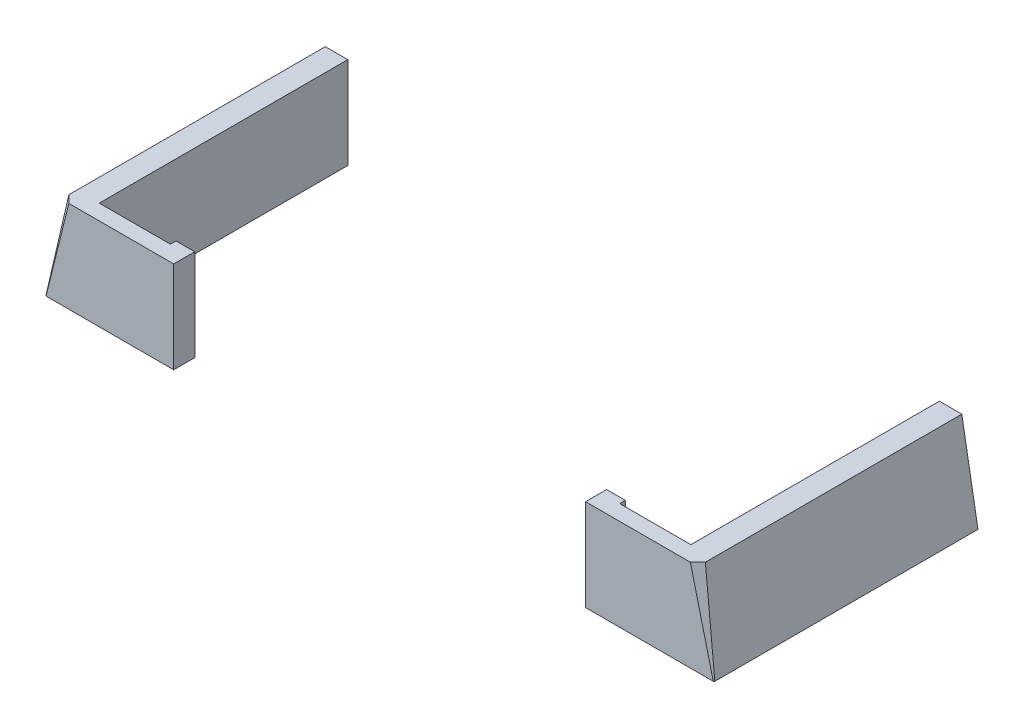
ISO-10303-21;
HEADER;
FILE_DESCRIPTION(('STEP AP214'),'2;1');
FILE_NAME('part.step','',(''),(''),'','','');
FILE_SCHEMA(('AUTOMOTIVE_DESIGN { 1 0 10303 214 1 1 1 1 }'));
ENDSEC;
DATA;
#1=APPLICATION_CONTEXT('core data for automotive mechanical design processes');
#2=APPLICATION_PROTOCOL_DEFINITION('international standard','automotive_design',2000,#1);
#3=PRODUCT_CONTEXT('',#1,'mechanical');
#4=PRODUCT('Part','Part','',(#3));
#5=PRODUCT_RELATED_PRODUCT_CATEGORY('part','',(#4));
#6=PRODUCT_DEFINITION_FORMATION('','',#4);
#7=PRODUCT_DEFINITION_CONTEXT('part definition',#1,'design');
#8=PRODUCT_DEFINITION('design','',#6,#7);
#9=PRODUCT_DEFINITION_SHAPE('','',#8);
#10=(LENGTH_UNIT() NAMED_UNIT(*) SI_UNIT(.MILLI.,.METRE.));
#11=(NAMED_UNIT(*) PLANE_ANGLE_UNIT() SI_UNIT($,.RADIAN.));
#12=(NAMED_UNIT(*) SI_UNIT($,.STERADIAN.) SOLID_ANGLE_UNIT());
#13=UNCERTAINTY_MEASURE_WITH_UNIT(LENGTH_MEASURE(1.E-05),#10,'distance_accuracy_value','');
#14=(GEOMETRIC_REPRESENTATION_CONTEXT(3) GLOBAL_UNCERTAINTY_ASSIGNED_CONTEXT((#13)) GLOBAL_UNIT_ASSIGNED_CONTEXT((#10,
#11,#12)) REPRESENTATION_CONTEXT('',''));
#15=CARTESIAN_POINT('',(0.,0.,0.));
#16=DIRECTION('',(0.,0.,1.));
#17=DIRECTION('',(1.,0.,0.));
#18=AXIS2_PLACEMENT_3D('',#15,#16,#17);
#19=CARTESIAN_POINT('',(170.,24.,37.24249361));
#20=DIRECTION('',(0.984807753012208,0.173648177666931,0.));
#21=DIRECTION('',(-0.173648177666931,0.984807753012208,0.));
#22=AXIS2_PLACEMENT_3D('',#19,#20,#21);
#23=PLANE('',#22);
#24=DIRECTION('',(0.,0.,-1.));
#25=VECTOR('',#24,1.);
#26=CARTESIAN_POINT('',(178.640022054715,-25.,37.24249361));
#27=LINE('',#26,#25);
#28=CARTESIAN_POINT('',(178.640022054715,-25.,40.8213079242656));
#29=VERTEX_POINT('',#28);
#30=CARTESIAN_POINT('',(178.640022054715,-25.,-99.75750639));
#31=VERTEX_POINT('',#30);
#32=EDGE_CURVE('E61',#29,#31,#27,.T.);
#33=ORIENTED_EDGE('',*,*,#32,.T.);
#34=DIRECTION('',(-0.173648177666931,0.984807753012208,0.));
#35=VECTOR('',#34,1.);
#36=CARTESIAN_POINT('',(204.584241247155,-172.136978630262,-99.75750639));
#37=LINE('',#36,#35);
#38=CARTESIAN_POINT('',(170.,24.,-99.75750639));
#39=VERTEX_POINT('',#38);
#40=EDGE_CURVE('E168',#31,#39,#37,.T.);
#41=ORIENTED_EDGE('',*,*,#40,.T.);
#42=DIRECTION('',(0.,0.,1.));
#43=VECTOR('',#42,1.);
#44=CARTESIAN_POINT('',(170.,24.,37.24249361));
#45=LINE('',#44,#43);
#46=CARTESIAN_POINT('',(170.,24.,37.24249361));
#47=VERTEX_POINT('',#46);
#48=EDGE_CURVE('E138',#39,#47,#45,.T.);
#49=ORIENTED_EDGE('',*,*,#48,.T.);
#50=DIRECTION('',(-0.173200723896954,0.982270116581418,-0.0717420888509561));
#51=VECTOR('',#50,1.);
#52=CARTESIAN_POINT('',(170.,24.,37.24249361));
#53=LINE('',#52,#51);
#54=EDGE_CURVE('E162',#29,#47,#53,.T.);
#55=ORIENTED_EDGE('',*,*,#54,.F.);
#56=EDGE_LOOP('',(#33,#41,#49,#55));
#57=FACE_BOUND('',#56,.T.);
#58=ADVANCED_FACE('F54',(#57),#23,.T.);
#59=CARTESIAN_POINT('',(170.,-178.235113469466,-99.75750639));
#60=DIRECTION('',(0.,0.,-1.));
#61=DIRECTION('',(1.,0.,0.));
#62=AXIS2_PLACEMENT_3D('',#59,#60,#61);
#63=PLANE('',#62);
#64=DIRECTION('',(-1.,0.,0.));
#65=VECTOR('',#64,1.);
#66=CARTESIAN_POINT('',(170.,-25.,-99.75750639));
#67=LINE('',#66,#65);
#68=CARTESIAN_POINT('',(158.,-25.,-99.7575063899999));
#69=VERTEX_POINT('',#68);
#70=EDGE_CURVE('E89',#31,#69,#67,.T.);
#71=ORIENTED_EDGE('',*,*,#70,.T.);
#72=DIRECTION('',(0.,1.,0.));
#73=VECTOR('',#72,1.);
#74=CARTESIAN_POINT('',(158.,-178.235113469466,-99.7575063899999));
#75=LINE('',#74,#73);
#76=CARTESIAN_POINT('',(158.,24.,-99.7575063899999));
#77=VERTEX_POINT('',#76);
#78=EDGE_CURVE('E161',#69,#77,#75,.T.);
#79=ORIENTED_EDGE('',*,*,#78,.T.);
#80=DIRECTION('',(1.,0.,0.));
#81=VECTOR('',#80,1.);
#82=CARTESIAN_POINT('',(170.,24.,-99.75750639));
#83=LINE('',#82,#81);
#84=EDGE_CURVE('E159',#77,#39,#83,.T.);
#85=ORIENTED_EDGE('',*,*,#84,.T.);
#86=ORIENTED_EDGE('',*,*,#40,.F.);
#87=EDGE_LOOP('',(#71,#79,#85,#86));
#88=FACE_BOUND('',#87,.T.);
#89=ADVANCED_FACE('F213',(#88),#63,.T.);
#90=CARTESIAN_POINT('',(158.,-178.235113469466,-99.7575063899999));
#91=DIRECTION('',(-1.,0.,0.));
#92=DIRECTION('',(0.,0.,-1.));
#93=AXIS2_PLACEMENT_3D('',#90,#91,#92);
#94=PLANE('',#93);
#95=DIRECTION('',(0.,0.,1.));
#96=VECTOR('',#95,1.);
#97=CARTESIAN_POINT('',(158.,-25.,-99.7575063899999));
#98=LINE('',#97,#96);
#99=CARTESIAN_POINT('',(158.,-25.,33.00249361));
#100=VERTEX_POINT('',#99);
#101=EDGE_CURVE('E95',#69,#100,#98,.T.);
#102=ORIENTED_EDGE('',*,*,#101,.T.);
#103=DIRECTION('',(0.,1.,0.));
#104=VECTOR('',#103,1.);
#105=CARTESIAN_POINT('',(158.,-178.235113469466,33.00249361));
#106=LINE('',#105,#104);
#107=CARTESIAN_POINT('',(158.,24.,33.00249361));
#108=VERTEX_POINT('',#107);
#109=EDGE_CURVE('E170',#100,#108,#106,.T.);
#110=ORIENTED_EDGE('',*,*,#109,.T.);
#111=DIRECTION('',(0.,0.,-1.));
#112=VECTOR('',#111,1.);
#113=CARTESIAN_POINT('',(158.,24.,-99.7575063899999));
#114=LINE('',#113,#112);
#115=EDGE_CURVE('E157',#108,#77,#114,.T.);
#116=ORIENTED_EDGE('',*,*,#115,.T.);
#117=ORIENTED_EDGE('',*,*,#78,.F.);
#118=EDGE_LOOP('',(#102,#110,#116,#117));
#119=FACE_BOUND('',#118,.T.);
#120=ADVANCED_FACE('F218',(#119),#94,.T.);
#121=CARTESIAN_POINT('',(120.,-178.235113469466,33.00249361));
#122=DIRECTION('',(0.,0.,-1.));
#123=DIRECTION('',(1.,0.,0.));
#124=AXIS2_PLACEMENT_3D('',#121,#122,#123);
#125=PLANE('',#124);
#126=DIRECTION('',(-1.,0.,0.));
#127=VECTOR('',#126,1.);
#128=CARTESIAN_POINT('',(120.,-25.,33.00249361));
#129=LINE('',#128,#127);
#130=CARTESIAN_POINT('',(120.,-25.,33.00249361));
#131=VERTEX_POINT('',#130);
#132=EDGE_CURVE('E134',#100,#131,#129,.T.);
#133=ORIENTED_EDGE('',*,*,#132,.T.);
#134=DIRECTION('',(0.,1.,0.));
#135=VECTOR('',#134,1.);
#136=CARTESIAN_POINT('',(120.,-178.235113469466,33.00249361));
#137=LINE('',#136,#135);
#138=CARTESIAN_POINT('',(120.,24.,33.00249361));
#139=VERTEX_POINT('',#138);
#140=EDGE_CURVE('E123',#131,#139,#137,.T.);
#141=ORIENTED_EDGE('',*,*,#140,.T.);
#142=DIRECTION('',(1.,0.,0.));
#143=VECTOR('',#142,1.);
#144=CARTESIAN_POINT('',(120.,24.,33.00249361));
#145=LINE('',#144,#143);
#146=EDGE_CURVE('E155',#139,#108,#145,.T.);
#147=ORIENTED_EDGE('',*,*,#146,.T.);
#148=ORIENTED_EDGE('',*,*,#109,.F.);
#149=EDGE_LOOP('',(#133,#141,#147,#148));
#150=FACE_BOUND('',#149,.T.);
#151=ADVANCED_FACE('F224',(#150),#125,.T.);
#152=CARTESIAN_POINT('',(120.,-178.235113469466,30.));
#153=DIRECTION('',(1.,0.,0.));
#154=DIRECTION('',(0.,0.,1.));
#155=AXIS2_PLACEMENT_3D('',#152,#153,#154);
#156=PLANE('',#155);
#157=DIRECTION('',(0.,0.,-1.));
#158=VECTOR('',#157,1.);
#159=CARTESIAN_POINT('',(120.,-25.,30.));
#160=LINE('',#159,#158);
#161=CARTESIAN_POINT('',(120.,-25.,30.));
#162=VERTEX_POINT('',#161);
#163=EDGE_CURVE('E110',#131,#162,#160,.T.);
#164=ORIENTED_EDGE('',*,*,#163,.T.);
#165=DIRECTION('',(0.,1.,0.));
#166=VECTOR('',#165,1.);
#167=CARTESIAN_POINT('',(120.,-178.235113469466,30.));
#168=LINE('',#167,#166);
#169=CARTESIAN_POINT('',(120.,24.,30.));
#170=VERTEX_POINT('',#169);
#171=EDGE_CURVE('E120',#162,#170,#168,.T.);
#172=ORIENTED_EDGE('',*,*,#171,.T.);
#173=DIRECTION('',(0.,0.,1.));
#174=VECTOR('',#173,1.);
#175=CARTESIAN_POINT('',(120.,24.,30.));
#176=LINE('',#175,#174);
#177=EDGE_CURVE('E154',#170,#139,#176,.T.);
#178=ORIENTED_EDGE('',*,*,#177,.T.);
#179=ORIENTED_EDGE('',*,*,#140,.F.);
#180=EDGE_LOOP('',(#164,#172,#178,#179));
#181=FACE_BOUND('',#180,.T.);
#182=ADVANCED_FACE('F129',(#181),#156,.T.);
#183=CARTESIAN_POINT('',(120.,-178.235113469466,30.));
#184=DIRECTION('',(0.,0.,-1.));
#185=DIRECTION('',(1.,0.,0.));
#186=AXIS2_PLACEMENT_3D('',#183,#184,#185);
#187=PLANE('',#186);
#188=DIRECTION('',(-1.,0.,0.));
#189=VECTOR('',#188,1.);
#190=CARTESIAN_POINT('',(120.,-25.,30.));
#191=LINE('',#190,#189);
#192=CARTESIAN_POINT('',(110.,-25.,30.));
#193=VERTEX_POINT('',#192);
#194=EDGE_CURVE('E101',#162,#193,#191,.T.);
#195=ORIENTED_EDGE('',*,*,#194,.T.);
#196=DIRECTION('',(0.,1.,0.));
#197=VECTOR('',#196,1.);
#198=CARTESIAN_POINT('',(110.,-178.235113469466,30.));
#199=LINE('',#198,#197);
#200=CARTESIAN_POINT('',(110.,24.,30.));
#201=VERTEX_POINT('',#200);
#202=EDGE_CURVE('E127',#193,#201,#199,.T.);
#203=ORIENTED_EDGE('',*,*,#202,.T.);
#204=DIRECTION('',(1.,0.,0.));
#205=VECTOR('',#204,1.);
#206=CARTESIAN_POINT('',(120.,24.,30.));
#207=LINE('',#206,#205);
#208=EDGE_CURVE('E122',#201,#170,#207,.T.);
#209=ORIENTED_EDGE('',*,*,#208,.T.);
#210=ORIENTED_EDGE('',*,*,#171,.F.);
#211=EDGE_LOOP('',(#195,#203,#209,#210));
#212=FACE_BOUND('',#211,.T.);
#213=ADVANCED_FACE('F117',(#212),#187,.T.);
#214=CARTESIAN_POINT('',(110.,-178.235113469466,30.));
#215=DIRECTION('',(-1.,0.,0.));
#216=DIRECTION('',(0.,0.,-1.));
#217=AXIS2_PLACEMENT_3D('',#214,#215,#216);
#218=PLANE('',#217);
#219=DIRECTION('',(0.,0.,1.));
#220=VECTOR('',#219,1.);
#221=CARTESIAN_POINT('',(110.,-25.,30.));
#222=LINE('',#221,#220);
#223=CARTESIAN_POINT('',(110.,-25.,41.24249361));
#224=VERTEX_POINT('',#223);
#225=EDGE_CURVE('E109',#193,#224,#222,.T.);
#226=ORIENTED_EDGE('',*,*,#225,.T.);
#227=DIRECTION('',(0.,1.,0.));
#228=VECTOR('',#227,1.);
#229=CARTESIAN_POINT('',(110.,-178.235113469466,41.24249361));
#230=LINE('',#229,#228);
#231=CARTESIAN_POINT('',(110.,24.,41.24249361));
#232=VERTEX_POINT('',#231);
#233=EDGE_CURVE('E175',#224,#232,#230,.T.);
#234=ORIENTED_EDGE('',*,*,#233,.T.);
#235=DIRECTION('',(0.,0.,-1.));
#236=VECTOR('',#235,1.);
#237=CARTESIAN_POINT('',(110.,24.,30.));
#238=LINE('',#237,#236);
#239=EDGE_CURVE('E150',#232,#201,#238,.T.);
#240=ORIENTED_EDGE('',*,*,#239,.T.);
#241=ORIENTED_EDGE('',*,*,#202,.F.);
#242=EDGE_LOOP('',(#226,#234,#240,#241));
#243=FACE_BOUND('',#242,.T.);
#244=ADVANCED_FACE('F183',(#243),#218,.T.);
#245=CARTESIAN_POINT('',(110.,-178.235113469466,41.24249361));
#246=DIRECTION('',(0.,0.,1.));
#247=DIRECTION('',(-1.,0.,0.));
#248=AXIS2_PLACEMENT_3D('',#245,#246,#247);
#249=PLANE('',#248);
#250=DIRECTION('',(1.,0.,0.));
#251=VECTOR('',#250,1.);
#252=CARTESIAN_POINT('',(110.,-25.,41.24249361));
#253=LINE('',#252,#251);
#254=CARTESIAN_POINT('',(178.21883636898,-25.,41.24249361));
#255=VERTEX_POINT('',#254);
#256=EDGE_CURVE('E73',#224,#255,#253,.T.);
#257=ORIENTED_EDGE('',*,*,#256,.T.);
#258=DIRECTION('',(-0.241954785752365,0.970287525247814,0.));
#259=VECTOR('',#258,1.);
#260=CARTESIAN_POINT('',(166.,24.,41.24249361));
#261=LINE('',#260,#259);
#262=CARTESIAN_POINT('',(166.,24.,41.24249361));
#263=VERTEX_POINT('',#262);
#264=EDGE_CURVE('E59',#255,#263,#261,.T.);
#265=ORIENTED_EDGE('',*,*,#264,.T.);
#266=DIRECTION('',(-1.,0.,0.));
#267=VECTOR('',#266,1.);
#268=CARTESIAN_POINT('',(110.,24.,41.24249361));
#269=LINE('',#268,#267);
#270=EDGE_CURVE('E144',#263,#232,#269,.T.);
#271=ORIENTED_EDGE('',*,*,#270,.T.);
#272=ORIENTED_EDGE('',*,*,#233,.F.);
#273=EDGE_LOOP('',(#257,#265,#271,#272));
#274=FACE_BOUND('',#273,.T.);
#275=ADVANCED_FACE('F209',(#274),#249,.T.);
#276=CARTESIAN_POINT('',(166.,24.,41.24249361));
#277=DIRECTION('',(0.696364240320019,0.173648177666931,0.696364240320019));
#278=DIRECTION('',(-0.122787803968973,0.984807753012208,-0.122787803968973));
#279=AXIS2_PLACEMENT_3D('',#276,#277,#278);
#280=PLANE('',#279);
#281=DIRECTION('',(0.707106781186548,0.,-0.707106781186548));
#282=VECTOR('',#281,1.);
#283=CARTESIAN_POINT('',(172.10941818449,-25.,47.3519117944902));
#284=LINE('',#283,#282);
#285=EDGE_CURVE('E12',#255,#29,#284,.T.);
#286=ORIENTED_EDGE('',*,*,#285,.T.);
#287=ORIENTED_EDGE('',*,*,#54,.T.);
#288=DIRECTION('',(-0.707106781186547,0.,0.707106781186547));
#289=VECTOR('',#288,1.);
#290=CARTESIAN_POINT('',(166.,24.,41.24249361));
#291=LINE('',#290,#289);
#292=EDGE_CURVE('E142',#47,#263,#291,.T.);
#293=ORIENTED_EDGE('',*,*,#292,.T.);
#294=ORIENTED_EDGE('',*,*,#264,.F.);
#295=EDGE_LOOP('',(#286,#287,#293,#294));
#296=FACE_BOUND('',#295,.T.);
#297=ADVANCED_FACE('F207',(#296),#280,.T.);
#298=CARTESIAN_POINT('',(0.,24.,0.));
#299=DIRECTION('',(0.,-1.,0.));
#300=DIRECTION('',(0.,0.,-1.));
#301=AXIS2_PLACEMENT_3D('',#298,#299,#300);
#302=PLANE('',#301);
#303=ORIENTED_EDGE('',*,*,#48,.F.);
#304=ORIENTED_EDGE('',*,*,#84,.F.);
#305=ORIENTED_EDGE('',*,*,#115,.F.);
#306=ORIENTED_EDGE('',*,*,#146,.F.);
#307=ORIENTED_EDGE('',*,*,#177,.F.);
#308=ORIENTED_EDGE('',*,*,#208,.F.);
#309=ORIENTED_EDGE('',*,*,#239,.F.);
#310=ORIENTED_EDGE('',*,*,#270,.F.);
#311=ORIENTED_EDGE('',*,*,#292,.F.);
#312=EDGE_LOOP('',(#303,#304,#305,#306,#307,#308,#309,#310,#311));
#313=FACE_BOUND('',#312,.T.);
#314=ADVANCED_FACE('F214',(#313),#302,.F.);
#315=CARTESIAN_POINT('',(0.,-25.,0.));
#316=DIRECTION('',(0.,1.,0.));
#317=DIRECTION('',(0.,0.,1.));
#318=AXIS2_PLACEMENT_3D('',#315,#316,#317);
#319=PLANE('',#318);
#320=ORIENTED_EDGE('',*,*,#32,.F.);
#321=ORIENTED_EDGE('',*,*,#285,.F.);
#322=ORIENTED_EDGE('',*,*,#256,.F.);
#323=ORIENTED_EDGE('',*,*,#225,.F.);
#324=ORIENTED_EDGE('',*,*,#194,.F.);
#325=ORIENTED_EDGE('',*,*,#163,.F.);
#326=ORIENTED_EDGE('',*,*,#132,.F.);
#327=ORIENTED_EDGE('',*,*,#101,.F.);
#328=ORIENTED_EDGE('',*,*,#70,.F.);
#329=EDGE_LOOP('',(#320,#321,#322,#323,#324,#325,#326,#327,#328));
#330=FACE_BOUND('',#329,.T.);
#331=ADVANCED_FACE('F102',(#330),#319,.F.);
#332=CLOSED_SHELL('',(#58,#89,#120,#151,#182,#213,#244,#275,#297,#314,#331));
#333=MANIFOLD_SOLID_BREP('B2',#332);
#334=CARTESIAN_POINT('',(-170.,24.,37.24249361));
#335=DIRECTION('',(-0.984807753012208,0.173648177666931,0.));
#336=DIRECTION('',(0.173648177666931,0.984807753012208,0.));
#337=AXIS2_PLACEMENT_3D('',#334,#335,#336);
#338=PLANE('',#337);
#339=DIRECTION('',(0.,0.,-1.));
#340=VECTOR('',#339,1.);
#341=CARTESIAN_POINT('',(-178.640022054715,-25.,37.24249361));
#342=LINE('',#341,#340);
#343=CARTESIAN_POINT('',(-178.640022054715,-25.,40.8213079242656));
#344=VERTEX_POINT('',#343);
#345=CARTESIAN_POINT('',(-178.640022054715,-25.,-99.75750639));
#346=VERTEX_POINT('',#345);
#347=EDGE_CURVE('E325',#344,#346,#342,.T.);
#348=ORIENTED_EDGE('',*,*,#347,.F.);
#349=DIRECTION('',(0.173200723896954,0.982270116581418,-0.0717420888509561));
#350=VECTOR('',#349,1.);
#351=CARTESIAN_POINT('',(-170.,24.,37.24249361));
#352=LINE('',#351,#350);
#353=CARTESIAN_POINT('',(-170.,24.,37.24249361));
#354=VERTEX_POINT('',#353);
#355=EDGE_CURVE('E396',#344,#354,#352,.T.);
#356=ORIENTED_EDGE('',*,*,#355,.T.);
#357=DIRECTION('',(0.,0.,1.));
#358=VECTOR('',#357,1.);
#359=CARTESIAN_POINT('',(-170.,24.,37.24249361));
#360=LINE('',#359,#358);
#361=CARTESIAN_POINT('',(-170.,24.,-99.75750639));
#362=VERTEX_POINT('',#361);
#363=EDGE_CURVE('E453',#362,#354,#360,.T.);
#364=ORIENTED_EDGE('',*,*,#363,.F.);
#365=DIRECTION('',(0.173648177666931,0.984807753012208,0.));
#366=VECTOR('',#365,1.);
#367=CARTESIAN_POINT('',(-204.584241247155,-172.136978630262,-99.75750639));
#368=LINE('',#367,#366);
#369=EDGE_CURVE('E407',#346,#362,#368,.T.);
#370=ORIENTED_EDGE('',*,*,#369,.F.);
#371=EDGE_LOOP('',(#348,#356,#364,#370));
#372=FACE_BOUND('',#371,.T.);
#373=ADVANCED_FACE('F315',(#372),#338,.T.);
#374=CARTESIAN_POINT('',(-170.,-178.235113469466,-99.75750639));
#375=DIRECTION('',(0.,0.,-1.));
#376=DIRECTION('',(-1.,0.,0.));
#377=AXIS2_PLACEMENT_3D('',#374,#375,#376);
#378=PLANE('',#377);
#379=DIRECTION('',(1.,0.,0.));
#380=VECTOR('',#379,1.);
#381=CARTESIAN_POINT('',(-170.,-25.,-99.75750639));
#382=LINE('',#381,#380);
#383=CARTESIAN_POINT('',(-158.,-25.,-99.7575063899999));
#384=VERTEX_POINT('',#383);
#385=EDGE_CURVE('E346',#346,#384,#382,.T.);
#386=ORIENTED_EDGE('',*,*,#385,.F.);
#387=ORIENTED_EDGE('',*,*,#369,.T.);
#388=DIRECTION('',(-1.,0.,0.));
#389=VECTOR('',#388,1.);
#390=CARTESIAN_POINT('',(-170.,24.,-99.75750639));
#391=LINE('',#390,#389);
#392=CARTESIAN_POINT('',(-158.,24.,-99.7575063899999));
#393=VERTEX_POINT('',#392);
#394=EDGE_CURVE('E401',#393,#362,#391,.T.);
#395=ORIENTED_EDGE('',*,*,#394,.F.);
#396=DIRECTION('',(0.,1.,0.));
#397=VECTOR('',#396,1.);
#398=CARTESIAN_POINT('',(-158.,-178.235113469466,-99.7575063899999));
#399=LINE('',#398,#397);
#400=EDGE_CURVE('E408',#384,#393,#399,.T.);
#401=ORIENTED_EDGE('',*,*,#400,.F.);
#402=EDGE_LOOP('',(#386,#387,#395,#401));
#403=FACE_BOUND('',#402,.T.);
#404=ADVANCED_FACE('F503',(#403),#378,.T.);
#405=CARTESIAN_POINT('',(-158.,-178.235113469466,-99.7575063899999));
#406=DIRECTION('',(1.,0.,0.));
#407=DIRECTION('',(0.,0.,-1.));
#408=AXIS2_PLACEMENT_3D('',#405,#406,#407);
#409=PLANE('',#408);
#410=DIRECTION('',(0.,0.,1.));
#411=VECTOR('',#410,1.);
#412=CARTESIAN_POINT('',(-158.,-25.,-99.7575063899999));
#413=LINE('',#412,#411);
#414=CARTESIAN_POINT('',(-158.,-25.,33.00249361));
#415=VERTEX_POINT('',#414);
#416=EDGE_CURVE('E462',#384,#415,#413,.T.);
#417=ORIENTED_EDGE('',*,*,#416,.F.);
#418=ORIENTED_EDGE('',*,*,#400,.T.);
#419=DIRECTION('',(0.,0.,-1.));
#420=VECTOR('',#419,1.);
#421=CARTESIAN_POINT('',(-158.,24.,-99.7575063899999));
#422=LINE('',#421,#420);
#423=CARTESIAN_POINT('',(-158.,24.,33.00249361));
#424=VERTEX_POINT('',#423);
#425=EDGE_CURVE('E431',#424,#393,#422,.T.);
#426=ORIENTED_EDGE('',*,*,#425,.F.);
#427=DIRECTION('',(0.,1.,0.));
#428=VECTOR('',#427,1.);
#429=CARTESIAN_POINT('',(-158.,-178.235113469466,33.00249361));
#430=LINE('',#429,#428);
#431=EDGE_CURVE('E394',#415,#424,#430,.T.);
#432=ORIENTED_EDGE('',*,*,#431,.F.);
#433=EDGE_LOOP('',(#417,#418,#426,#432));
#434=FACE_BOUND('',#433,.T.);
#435=ADVANCED_FACE('F475',(#434),#409,.T.);
#436=CARTESIAN_POINT('',(-120.,-178.235113469466,33.00249361));
#437=DIRECTION('',(0.,0.,-1.));
#438=DIRECTION('',(-1.,0.,0.));
#439=AXIS2_PLACEMENT_3D('',#436,#437,#438);
#440=PLANE('',#439);
#441=DIRECTION('',(1.,0.,0.));
#442=VECTOR('',#441,1.);
#443=CARTESIAN_POINT('',(-120.,-25.,33.00249361));
#444=LINE('',#443,#442);
#445=CARTESIAN_POINT('',(-120.,-25.,33.00249361));
#446=VERTEX_POINT('',#445);
#447=EDGE_CURVE('E361',#415,#446,#444,.T.);
#448=ORIENTED_EDGE('',*,*,#447,.F.);
#449=ORIENTED_EDGE('',*,*,#431,.T.);
#450=DIRECTION('',(-1.,0.,0.));
#451=VECTOR('',#450,1.);
#452=CARTESIAN_POINT('',(-120.,24.,33.00249361));
#453=LINE('',#452,#451);
#454=CARTESIAN_POINT('',(-120.,24.,33.00249361));
#455=VERTEX_POINT('',#454);
#456=EDGE_CURVE('E432',#455,#424,#453,.T.);
#457=ORIENTED_EDGE('',*,*,#456,.F.);
#458=DIRECTION('',(0.,1.,0.));
#459=VECTOR('',#458,1.);
#460=CARTESIAN_POINT('',(-120.,-178.235113469466,33.00249361));
#461=LINE('',#460,#459);
#462=EDGE_CURVE('E390',#446,#455,#461,.T.);
#463=ORIENTED_EDGE('',*,*,#462,.F.);
#464=EDGE_LOOP('',(#448,#449,#457,#463));
#465=FACE_BOUND('',#464,.T.);
#466=ADVANCED_FACE('F469',(#465),#440,.T.);
#467=CARTESIAN_POINT('',(-120.,-178.235113469466,30.));
#468=DIRECTION('',(-1.,0.,0.));
#469=DIRECTION('',(0.,0.,1.));
#470=AXIS2_PLACEMENT_3D('',#467,#468,#469);
#471=PLANE('',#470);
#472=DIRECTION('',(0.,0.,-1.));
#473=VECTOR('',#472,1.);
#474=CARTESIAN_POINT('',(-120.,-25.,30.));
#475=LINE('',#474,#473);
#476=CARTESIAN_POINT('',(-120.,-25.,30.));
#477=VERTEX_POINT('',#476);
#478=EDGE_CURVE('E356',#446,#477,#475,.T.);
#479=ORIENTED_EDGE('',*,*,#478,.F.);
#480=ORIENTED_EDGE('',*,*,#462,.T.);
#481=DIRECTION('',(0.,0.,1.));
#482=VECTOR('',#481,1.);
#483=CARTESIAN_POINT('',(-120.,24.,30.));
#484=LINE('',#483,#482);
#485=CARTESIAN_POINT('',(-120.,24.,30.));
#486=VERTEX_POINT('',#485);
#487=EDGE_CURVE('E381',#486,#455,#484,.T.);
#488=ORIENTED_EDGE('',*,*,#487,.F.);
#489=DIRECTION('',(0.,1.,0.));
#490=VECTOR('',#489,1.);
#491=CARTESIAN_POINT('',(-120.,-178.235113469466,30.));
#492=LINE('',#491,#490);
#493=EDGE_CURVE('E376',#477,#486,#492,.T.);
#494=ORIENTED_EDGE('',*,*,#493,.F.);
#495=EDGE_LOOP('',(#479,#480,#488,#494));
#496=FACE_BOUND('',#495,.T.);
#497=ADVANCED_FACE('F385',(#496),#471,.T.);
#498=CARTESIAN_POINT('',(-120.,-178.235113469466,30.));
#499=DIRECTION('',(0.,0.,-1.));
#500=DIRECTION('',(-1.,0.,0.));
#501=AXIS2_PLACEMENT_3D('',#498,#499,#500);
#502=PLANE('',#501);
#503=DIRECTION('',(1.,0.,0.));
#504=VECTOR('',#503,1.);
#505=CARTESIAN_POINT('',(-120.,-25.,30.));
#506=LINE('',#505,#504);
#507=CARTESIAN_POINT('',(-110.,-25.,30.));
#508=VERTEX_POINT('',#507);
#509=EDGE_CURVE('E363',#477,#508,#506,.T.);
#510=ORIENTED_EDGE('',*,*,#509,.F.);
#511=ORIENTED_EDGE('',*,*,#493,.T.);
#512=DIRECTION('',(-1.,0.,0.));
#513=VECTOR('',#512,1.);
#514=CARTESIAN_POINT('',(-120.,24.,30.));
#515=LINE('',#514,#513);
#516=CARTESIAN_POINT('',(-110.,24.,30.));
#517=VERTEX_POINT('',#516);
#518=EDGE_CURVE('E439',#517,#486,#515,.T.);
#519=ORIENTED_EDGE('',*,*,#518,.F.);
#520=DIRECTION('',(0.,1.,0.));
#521=VECTOR('',#520,1.);
#522=CARTESIAN_POINT('',(-110.,-178.235113469466,30.));
#523=LINE('',#522,#521);
#524=EDGE_CURVE('E378',#508,#517,#523,.T.);
#525=ORIENTED_EDGE('',*,*,#524,.F.);
#526=EDGE_LOOP('',(#510,#511,#519,#525));
#527=FACE_BOUND('',#526,.T.);
#528=ADVANCED_FACE('F373',(#527),#502,.T.);
#529=CARTESIAN_POINT('',(-110.,-178.235113469466,30.));
#530=DIRECTION('',(1.,0.,0.));
#531=DIRECTION('',(0.,0.,-1.));
#532=AXIS2_PLACEMENT_3D('',#529,#530,#531);
#533=PLANE('',#532);
#534=DIRECTION('',(0.,0.,1.));
#535=VECTOR('',#534,1.);
#536=CARTESIAN_POINT('',(-110.,-25.,30.));
#537=LINE('',#536,#535);
#538=CARTESIAN_POINT('',(-110.,-25.,41.24249361));
#539=VERTEX_POINT('',#538);
#540=EDGE_CURVE('E332',#508,#539,#537,.T.);
#541=ORIENTED_EDGE('',*,*,#540,.F.);
#542=ORIENTED_EDGE('',*,*,#524,.T.);
#543=DIRECTION('',(0.,0.,-1.));
#544=VECTOR('',#543,1.);
#545=CARTESIAN_POINT('',(-110.,24.,30.));
#546=LINE('',#545,#544);
#547=CARTESIAN_POINT('',(-110.,24.,41.24249361));
#548=VERTEX_POINT('',#547);
#549=EDGE_CURVE('E442',#548,#517,#546,.T.);
#550=ORIENTED_EDGE('',*,*,#549,.F.);
#551=DIRECTION('',(0.,1.,0.));
#552=VECTOR('',#551,1.);
#553=CARTESIAN_POINT('',(-110.,-178.235113469466,41.24249361));
#554=LINE('',#553,#552);
#555=EDGE_CURVE('E395',#539,#548,#554,.T.);
#556=ORIENTED_EDGE('',*,*,#555,.F.);
#557=EDGE_LOOP('',(#541,#542,#550,#556));
#558=FACE_BOUND('',#557,.T.);
#559=ADVANCED_FACE('F505',(#558),#533,.T.);
#560=CARTESIAN_POINT('',(-110.,-178.235113469466,41.24249361));
#561=DIRECTION('',(0.,0.,1.));
#562=DIRECTION('',(1.,0.,0.));
#563=AXIS2_PLACEMENT_3D('',#560,#561,#562);
#564=PLANE('',#563);
#565=DIRECTION('',(-1.,0.,0.));
#566=VECTOR('',#565,1.);
#567=CARTESIAN_POINT('',(-110.,-25.,41.24249361));
#568=LINE('',#567,#566);
#569=CARTESIAN_POINT('',(-178.21883636898,-25.,41.24249361));
#570=VERTEX_POINT('',#569);
#571=EDGE_CURVE('E406',#539,#570,#568,.T.);
#572=ORIENTED_EDGE('',*,*,#571,.F.);
#573=ORIENTED_EDGE('',*,*,#555,.T.);
#574=DIRECTION('',(1.,0.,0.));
#575=VECTOR('',#574,1.);
#576=CARTESIAN_POINT('',(-110.,24.,41.24249361));
#577=LINE('',#576,#575);
#578=CARTESIAN_POINT('',(-166.,24.,41.24249361));
#579=VERTEX_POINT('',#578);
#580=EDGE_CURVE('E450',#579,#548,#577,.T.);
#581=ORIENTED_EDGE('',*,*,#580,.F.);
#582=DIRECTION('',(0.241954785752365,0.970287525247814,0.));
#583=VECTOR('',#582,1.);
#584=CARTESIAN_POINT('',(-166.,24.,41.24249361));
#585=LINE('',#584,#583);
#586=EDGE_CURVE('E314',#570,#579,#585,.T.);
#587=ORIENTED_EDGE('',*,*,#586,.F.);
#588=EDGE_LOOP('',(#572,#573,#581,#587));
#589=FACE_BOUND('',#588,.T.);
#590=ADVANCED_FACE('F487',(#589),#564,.T.);
#591=CARTESIAN_POINT('',(-166.,24.,41.24249361));
#592=DIRECTION('',(-0.696364240320019,0.173648177666931,0.696364240320019));
#593=DIRECTION('',(0.122787803968973,0.984807753012208,-0.122787803968973));
#594=AXIS2_PLACEMENT_3D('',#591,#592,#593);
#595=PLANE('',#594);
#596=DIRECTION('',(-0.707106781186548,0.,-0.707106781186548));
#597=VECTOR('',#596,1.);
#598=CARTESIAN_POINT('',(-172.10941818449,-25.,47.3519117944902));
#599=LINE('',#598,#597);
#600=EDGE_CURVE('E52',#570,#344,#599,.T.);
#601=ORIENTED_EDGE('',*,*,#600,.F.);
#602=ORIENTED_EDGE('',*,*,#586,.T.);
#603=DIRECTION('',(0.707106781186547,0.,0.707106781186547));
#604=VECTOR('',#603,1.);
#605=CARTESIAN_POINT('',(-166.,24.,41.24249361));
#606=LINE('',#605,#604);
#607=EDGE_CURVE('E452',#354,#579,#606,.T.);
#608=ORIENTED_EDGE('',*,*,#607,.F.);
#609=ORIENTED_EDGE('',*,*,#355,.F.);
#610=EDGE_LOOP('',(#601,#602,#608,#609));
#611=FACE_BOUND('',#610,.T.);
#612=ADVANCED_FACE('F491',(#611),#595,.T.);
#613=CARTESIAN_POINT('',(0.,24.,0.));
#614=DIRECTION('',(0.,-1.,0.));
#615=DIRECTION('',(0.,0.,-1.));
#616=AXIS2_PLACEMENT_3D('',#613,#614,#615);
#617=PLANE('',#616);
#618=ORIENTED_EDGE('',*,*,#363,.T.);
#619=ORIENTED_EDGE('',*,*,#607,.T.);
#620=ORIENTED_EDGE('',*,*,#580,.T.);
#621=ORIENTED_EDGE('',*,*,#549,.T.);
#622=ORIENTED_EDGE('',*,*,#518,.T.);
#623=ORIENTED_EDGE('',*,*,#487,.T.);
#624=ORIENTED_EDGE('',*,*,#456,.T.);
#625=ORIENTED_EDGE('',*,*,#425,.T.);
#626=ORIENTED_EDGE('',*,*,#394,.T.);
#627=EDGE_LOOP('',(#618,#619,#620,#621,#622,#623,#624,#625,#626));
#628=FACE_BOUND('',#627,.T.);
#629=ADVANCED_FACE('F479',(#628),#617,.F.);
#630=CARTESIAN_POINT('',(0.,-25.,0.));
#631=DIRECTION('',(0.,1.,0.));
#632=DIRECTION('',(0.,0.,1.));
#633=AXIS2_PLACEMENT_3D('',#630,#631,#632);
#634=PLANE('',#633);
#635=ORIENTED_EDGE('',*,*,#347,.T.);
#636=ORIENTED_EDGE('',*,*,#385,.T.);
#637=ORIENTED_EDGE('',*,*,#416,.T.);
#638=ORIENTED_EDGE('',*,*,#447,.T.);
#639=ORIENTED_EDGE('',*,*,#478,.T.);
#640=ORIENTED_EDGE('',*,*,#509,.T.);
#641=ORIENTED_EDGE('',*,*,#540,.T.);
#642=ORIENTED_EDGE('',*,*,#571,.T.);
#643=ORIENTED_EDGE('',*,*,#600,.T.);
#644=EDGE_LOOP('',(#635,#636,#637,#638,#639,#640,#641,#642,#643));
#645=FACE_BOUND('',#644,.T.);
#646=ADVANCED_FACE('F359',(#645),#634,.F.);
#647=CLOSED_SHELL('',(#373,#404,#435,#466,#497,#528,#559,#590,#612,#629,#646));
#648=MANIFOLD_SOLID_BREP('B6',#647);
#649=ADVANCED_BREP_SHAPE_REPRESENTATION('',(#18,#333,#648),#14);
#650=SHAPE_DEFINITION_REPRESENTATION(#9,#649);
ENDSEC;
END-ISO-10303-21;
